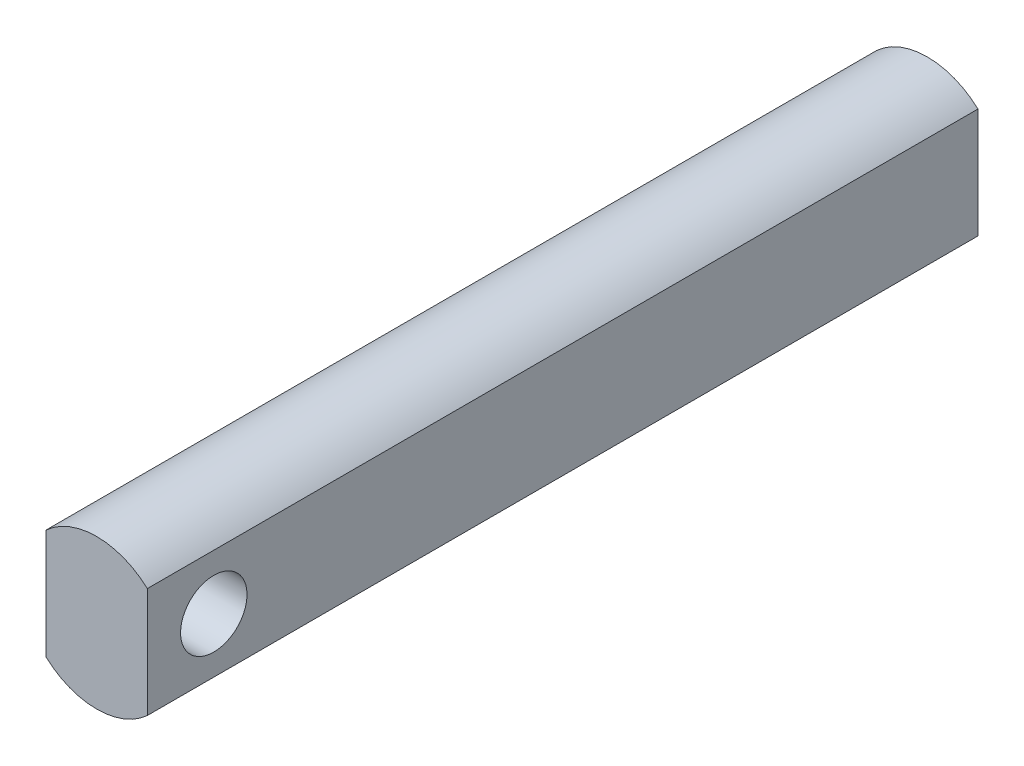
ISO-10303-21;
HEADER;
FILE_DESCRIPTION(('STEP AP214'),'2;1');
FILE_NAME('part.step','',(''),(''),'','','');
FILE_SCHEMA(('AUTOMOTIVE_DESIGN { 1 0 10303 214 1 1 1 1 }'));
ENDSEC;
DATA;
#1=APPLICATION_CONTEXT('core data for automotive mechanical design processes');
#2=APPLICATION_PROTOCOL_DEFINITION('international standard','automotive_design',2000,#1);
#3=PRODUCT_CONTEXT('',#1,'mechanical');
#4=PRODUCT('Part','Part','',(#3));
#5=PRODUCT_RELATED_PRODUCT_CATEGORY('part','',(#4));
#6=PRODUCT_DEFINITION_FORMATION('','',#4);
#7=PRODUCT_DEFINITION_CONTEXT('part definition',#1,'design');
#8=PRODUCT_DEFINITION('design','',#6,#7);
#9=PRODUCT_DEFINITION_SHAPE('','',#8);
#10=(LENGTH_UNIT() NAMED_UNIT(*) SI_UNIT(.MILLI.,.METRE.));
#11=(NAMED_UNIT(*) PLANE_ANGLE_UNIT() SI_UNIT($,.RADIAN.));
#12=(NAMED_UNIT(*) SI_UNIT($,.STERADIAN.) SOLID_ANGLE_UNIT());
#13=UNCERTAINTY_MEASURE_WITH_UNIT(LENGTH_MEASURE(1.E-05),#10,'distance_accuracy_value','');
#14=(GEOMETRIC_REPRESENTATION_CONTEXT(3) GLOBAL_UNCERTAINTY_ASSIGNED_CONTEXT((#13)) GLOBAL_UNIT_ASSIGNED_CONTEXT((#10,
#11,#12)) REPRESENTATION_CONTEXT('',''));
#15=CARTESIAN_POINT('',(0.,0.,0.));
#16=DIRECTION('',(0.,0.,1.));
#17=DIRECTION('',(1.,0.,0.));
#18=AXIS2_PLACEMENT_3D('',#15,#16,#17);
#19=CARTESIAN_POINT('',(0.,-0.999999999999997,50.));
#20=DIRECTION('',(0.,0.,-1.));
#21=DIRECTION('',(-1.,0.,0.));
#22=AXIS2_PLACEMENT_3D('',#19,#20,#21);
#23=CYLINDRICAL_SURFACE('',#22,4.5);
#24=CARTESIAN_POINT('',(0.,-0.999999999999997,0.));
#25=DIRECTION('',(0.,0.,1.));
#26=DIRECTION('',(1.,0.,0.));
#27=AXIS2_PLACEMENT_3D('',#24,#25,#26);
#28=CIRCLE('',#27,4.5);
#29=CARTESIAN_POINT('',(3.05,2.30870065131314,0.));
#30=VERTEX_POINT('',#29);
#31=CARTESIAN_POINT('',(-3.05,2.30870065131314,0.));
#32=VERTEX_POINT('',#31);
#33=EDGE_CURVE('E97',#30,#32,#28,.T.);
#34=ORIENTED_EDGE('',*,*,#33,.T.);
#35=DIRECTION('',(0.,0.,-1.));
#36=VECTOR('',#35,1.);
#37=CARTESIAN_POINT('',(-3.05,2.30870065131314,50.));
#38=LINE('',#37,#36);
#39=CARTESIAN_POINT('',(-3.05,2.30870065131314,50.));
#40=VERTEX_POINT('',#39);
#41=EDGE_CURVE('E11',#40,#32,#38,.T.);
#42=ORIENTED_EDGE('',*,*,#41,.F.);
#43=CARTESIAN_POINT('',(0.,-0.999999999999997,50.));
#44=DIRECTION('',(0.,0.,1.));
#45=DIRECTION('',(1.,0.,0.));
#46=AXIS2_PLACEMENT_3D('',#43,#44,#45);
#47=CIRCLE('',#46,4.5);
#48=CARTESIAN_POINT('',(3.05,2.30870065131314,50.));
#49=VERTEX_POINT('',#48);
#50=EDGE_CURVE('E85',#49,#40,#47,.T.);
#51=ORIENTED_EDGE('',*,*,#50,.F.);
#52=DIRECTION('',(0.,0.,-1.));
#53=VECTOR('',#52,1.);
#54=CARTESIAN_POINT('',(3.05,2.30870065131314,50.));
#55=LINE('',#54,#53);
#56=EDGE_CURVE('E93',#49,#30,#55,.T.);
#57=ORIENTED_EDGE('',*,*,#56,.T.);
#58=EDGE_LOOP('',(#34,#42,#51,#57));
#59=FACE_BOUND('',#58,.T.);
#60=ADVANCED_FACE('F34',(#59),#23,.T.);
#61=CARTESIAN_POINT('',(-3.05,2.30870065131314,50.));
#62=DIRECTION('',(1.,0.,0.));
#63=DIRECTION('',(0.,1.,0.));
#64=AXIS2_PLACEMENT_3D('',#61,#62,#63);
#65=PLANE('',#64);
#66=CARTESIAN_POINT('',(-3.05,-0.999999999999998,46.));
#67=DIRECTION('',(-1.,0.,0.));
#68=DIRECTION('',(0.,-1.,0.));
#69=AXIS2_PLACEMENT_3D('',#66,#67,#68);
#70=CIRCLE('',#69,2.);
#71=CARTESIAN_POINT('',(-3.05,-3.,46.));
#72=VERTEX_POINT('',#71);
#73=EDGE_CURVE('E111',#72,#72,#70,.T.);
#74=ORIENTED_EDGE('',*,*,#73,.F.);
#75=EDGE_LOOP('',(#74));
#76=FACE_BOUND('',#75,.T.);
#77=DIRECTION('',(0.,-1.,0.));
#78=VECTOR('',#77,1.);
#79=CARTESIAN_POINT('',(-3.05,2.30870065131314,0.));
#80=LINE('',#79,#78);
#81=CARTESIAN_POINT('',(-3.05,-4.30870065131314,0.));
#82=VERTEX_POINT('',#81);
#83=EDGE_CURVE('E89',#32,#82,#80,.T.);
#84=ORIENTED_EDGE('',*,*,#83,.T.);
#85=DIRECTION('',(0.,0.,-1.));
#86=VECTOR('',#85,1.);
#87=CARTESIAN_POINT('',(-3.05,-4.30870065131314,50.));
#88=LINE('',#87,#86);
#89=CARTESIAN_POINT('',(-3.05,-4.30870065131314,50.));
#90=VERTEX_POINT('',#89);
#91=EDGE_CURVE('E42',#90,#82,#88,.T.);
#92=ORIENTED_EDGE('',*,*,#91,.F.);
#93=DIRECTION('',(0.,-1.,0.));
#94=VECTOR('',#93,1.);
#95=CARTESIAN_POINT('',(-3.05,2.30870065131314,50.));
#96=LINE('',#95,#94);
#97=EDGE_CURVE('E80',#40,#90,#96,.T.);
#98=ORIENTED_EDGE('',*,*,#97,.F.);
#99=ORIENTED_EDGE('',*,*,#41,.T.);
#100=EDGE_LOOP('',(#84,#92,#98,#99));
#101=FACE_BOUND('',#100,.T.);
#102=ADVANCED_FACE('F88',(#76,#101),#65,.F.);
#103=CARTESIAN_POINT('',(0.,-0.999999999999997,50.));
#104=DIRECTION('',(0.,0.,-1.));
#105=DIRECTION('',(-1.,0.,0.));
#106=AXIS2_PLACEMENT_3D('',#103,#104,#105);
#107=CYLINDRICAL_SURFACE('',#106,4.5);
#108=CARTESIAN_POINT('',(0.,-0.999999999999997,0.));
#109=DIRECTION('',(0.,0.,1.));
#110=DIRECTION('',(1.,0.,0.));
#111=AXIS2_PLACEMENT_3D('',#108,#109,#110);
#112=CIRCLE('',#111,4.5);
#113=CARTESIAN_POINT('',(3.05,-4.30870065131314,0.));
#114=VERTEX_POINT('',#113);
#115=EDGE_CURVE('E67',#82,#114,#112,.T.);
#116=ORIENTED_EDGE('',*,*,#115,.T.);
#117=DIRECTION('',(0.,0.,-1.));
#118=VECTOR('',#117,1.);
#119=CARTESIAN_POINT('',(3.05,-4.30870065131314,50.));
#120=LINE('',#119,#118);
#121=CARTESIAN_POINT('',(3.05,-4.30870065131314,50.));
#122=VERTEX_POINT('',#121);
#123=EDGE_CURVE('E90',#122,#114,#120,.T.);
#124=ORIENTED_EDGE('',*,*,#123,.F.);
#125=CARTESIAN_POINT('',(0.,-0.999999999999997,50.));
#126=DIRECTION('',(0.,0.,1.));
#127=DIRECTION('',(1.,0.,0.));
#128=AXIS2_PLACEMENT_3D('',#125,#126,#127);
#129=CIRCLE('',#128,4.5);
#130=EDGE_CURVE('E83',#90,#122,#129,.T.);
#131=ORIENTED_EDGE('',*,*,#130,.F.);
#132=ORIENTED_EDGE('',*,*,#91,.T.);
#133=EDGE_LOOP('',(#116,#124,#131,#132));
#134=FACE_BOUND('',#133,.T.);
#135=ADVANCED_FACE('F91',(#134),#107,.T.);
#136=CARTESIAN_POINT('',(3.05,-4.30870065131314,50.));
#137=DIRECTION('',(-1.,0.,0.));
#138=DIRECTION('',(0.,0.,1.));
#139=AXIS2_PLACEMENT_3D('',#136,#137,#138);
#140=PLANE('',#139);
#141=CARTESIAN_POINT('',(3.05,-0.999999999999997,46.));
#142=DIRECTION('',(-1.,0.,0.));
#143=DIRECTION('',(0.,-1.,0.));
#144=AXIS2_PLACEMENT_3D('',#141,#142,#143);
#145=CIRCLE('',#144,2.);
#146=CARTESIAN_POINT('',(3.05,-3.,46.));
#147=VERTEX_POINT('',#146);
#148=EDGE_CURVE('E100',#147,#147,#145,.T.);
#149=ORIENTED_EDGE('',*,*,#148,.T.);
#150=EDGE_LOOP('',(#149));
#151=FACE_BOUND('',#150,.T.);
#152=DIRECTION('',(0.,1.,0.));
#153=VECTOR('',#152,1.);
#154=CARTESIAN_POINT('',(3.05,-4.30870065131314,0.));
#155=LINE('',#154,#153);
#156=EDGE_CURVE('E73',#114,#30,#155,.T.);
#157=ORIENTED_EDGE('',*,*,#156,.T.);
#158=ORIENTED_EDGE('',*,*,#56,.F.);
#159=DIRECTION('',(0.,1.,0.));
#160=VECTOR('',#159,1.);
#161=CARTESIAN_POINT('',(3.05,-4.30870065131314,50.));
#162=LINE('',#161,#160);
#163=EDGE_CURVE('E50',#122,#49,#162,.T.);
#164=ORIENTED_EDGE('',*,*,#163,.F.);
#165=ORIENTED_EDGE('',*,*,#123,.T.);
#166=EDGE_LOOP('',(#157,#158,#164,#165));
#167=FACE_BOUND('',#166,.T.);
#168=ADVANCED_FACE('F105',(#151,#167),#140,.F.);
#169=CARTESIAN_POINT('',(0.,-0.999999999999997,50.));
#170=DIRECTION('',(0.,0.,1.));
#171=DIRECTION('',(1.,0.,0.));
#172=AXIS2_PLACEMENT_3D('',#169,#170,#171);
#173=PLANE('',#172);
#174=ORIENTED_EDGE('',*,*,#50,.T.);
#175=ORIENTED_EDGE('',*,*,#97,.T.);
#176=ORIENTED_EDGE('',*,*,#130,.T.);
#177=ORIENTED_EDGE('',*,*,#163,.T.);
#178=EDGE_LOOP('',(#174,#175,#176,#177));
#179=FACE_BOUND('',#178,.T.);
#180=ADVANCED_FACE('F81',(#179),#173,.T.);
#181=CARTESIAN_POINT('',(0.,-0.999999999999997,0.));
#182=DIRECTION('',(0.,0.,1.));
#183=DIRECTION('',(1.,0.,0.));
#184=AXIS2_PLACEMENT_3D('',#181,#182,#183);
#185=PLANE('',#184);
#186=ORIENTED_EDGE('',*,*,#33,.F.);
#187=ORIENTED_EDGE('',*,*,#156,.F.);
#188=ORIENTED_EDGE('',*,*,#115,.F.);
#189=ORIENTED_EDGE('',*,*,#83,.F.);
#190=EDGE_LOOP('',(#186,#187,#188,#189));
#191=FACE_BOUND('',#190,.T.);
#192=ADVANCED_FACE('F108',(#191),#185,.F.);
#193=CARTESIAN_POINT('',(3.05,-0.999999999999997,46.));
#194=DIRECTION('',(-1.,0.,0.));
#195=DIRECTION('',(0.,-1.,0.));
#196=AXIS2_PLACEMENT_3D('',#193,#194,#195);
#197=CYLINDRICAL_SURFACE('',#196,2.);
#198=ORIENTED_EDGE('',*,*,#148,.F.);
#199=EDGE_LOOP('',(#198));
#200=FACE_BOUND('',#199,.T.);
#201=ORIENTED_EDGE('',*,*,#73,.T.);
#202=EDGE_LOOP('',(#201));
#203=FACE_BOUND('',#202,.T.);
#204=ADVANCED_FACE('F118',(#200,#203),#197,.F.);
#205=CLOSED_SHELL('',(#60,#102,#135,#168,#180,#192,#204));
#206=MANIFOLD_SOLID_BREP('B2',#205);
#207=ADVANCED_BREP_SHAPE_REPRESENTATION('',(#18,#206),#14);
#208=SHAPE_DEFINITION_REPRESENTATION(#9,#207);
ENDSEC;
END-ISO-10303-21;
